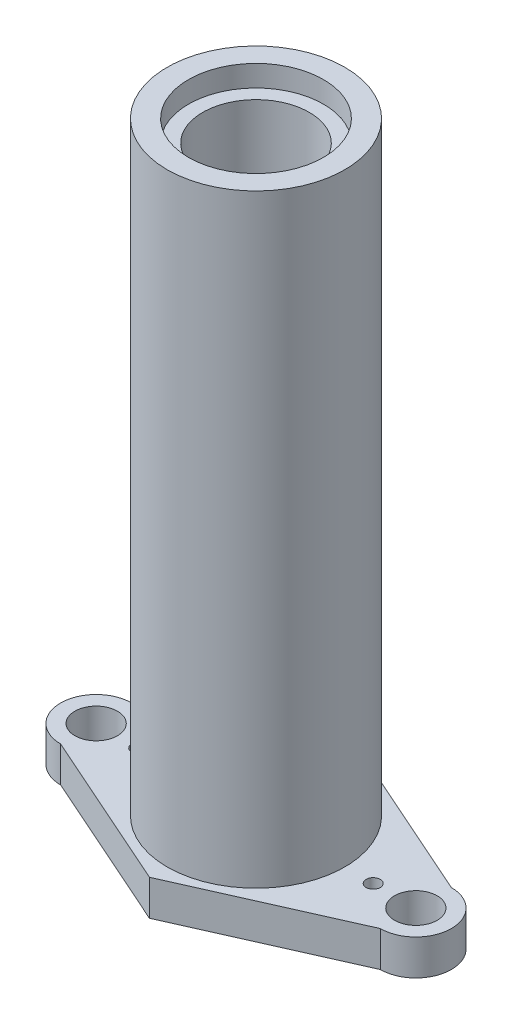
ISO-10303-21;
HEADER;
FILE_DESCRIPTION(('STEP AP214'),'2;1');
FILE_NAME('part.step','',(''),(''),'','','');
FILE_SCHEMA(('AUTOMOTIVE_DESIGN { 1 0 10303 214 1 1 1 1 }'));
ENDSEC;
DATA;
#1=APPLICATION_CONTEXT('core data for automotive mechanical design processes');
#2=APPLICATION_PROTOCOL_DEFINITION('international standard','automotive_design',2000,#1);
#3=PRODUCT_CONTEXT('',#1,'mechanical');
#4=PRODUCT('Part','Part','',(#3));
#5=PRODUCT_RELATED_PRODUCT_CATEGORY('part','',(#4));
#6=PRODUCT_DEFINITION_FORMATION('','',#4);
#7=PRODUCT_DEFINITION_CONTEXT('part definition',#1,'design');
#8=PRODUCT_DEFINITION('design','',#6,#7);
#9=PRODUCT_DEFINITION_SHAPE('','',#8);
#10=(LENGTH_UNIT() NAMED_UNIT(*) SI_UNIT(.MILLI.,.METRE.));
#11=(NAMED_UNIT(*) PLANE_ANGLE_UNIT() SI_UNIT($,.RADIAN.));
#12=(NAMED_UNIT(*) SI_UNIT($,.STERADIAN.) SOLID_ANGLE_UNIT());
#13=UNCERTAINTY_MEASURE_WITH_UNIT(LENGTH_MEASURE(1.E-05),#10,'distance_accuracy_value','');
#14=(GEOMETRIC_REPRESENTATION_CONTEXT(3) GLOBAL_UNCERTAINTY_ASSIGNED_CONTEXT((#13)) GLOBAL_UNIT_ASSIGNED_CONTEXT((#10,
#11,#12)) REPRESENTATION_CONTEXT('',''));
#15=CARTESIAN_POINT('',(0.,0.,0.));
#16=DIRECTION('',(0.,0.,1.));
#17=DIRECTION('',(1.,0.,0.));
#18=AXIS2_PLACEMENT_3D('',#15,#16,#17);
#19=CARTESIAN_POINT('',(0.,78.,0.869271295597634));
#20=DIRECTION('',(0.,1.,0.));
#21=DIRECTION('',(0.,0.,1.));
#22=AXIS2_PLACEMENT_3D('',#19,#20,#21);
#23=CYLINDRICAL_SURFACE('',#22,7.5);
#24=CARTESIAN_POINT('',(0.,78.,0.869271295597634));
#25=DIRECTION('',(0.,1.,0.));
#26=DIRECTION('',(0.,0.,1.));
#27=AXIS2_PLACEMENT_3D('',#24,#25,#26);
#28=CIRCLE('',#27,7.5);
#29=CARTESIAN_POINT('',(0.,78.,8.36927129559763));
#30=VERTEX_POINT('',#29);
#31=EDGE_CURVE('E167',#30,#30,#28,.T.);
#32=ORIENTED_EDGE('',*,*,#31,.F.);
#33=EDGE_LOOP('',(#32));
#34=FACE_BOUND('',#33,.T.);
#35=CARTESIAN_POINT('',(0.,87.,0.869271295597634));
#36=DIRECTION('',(0.,1.,0.));
#37=DIRECTION('',(0.,0.,1.));
#38=AXIS2_PLACEMENT_3D('',#35,#36,#37);
#39=CIRCLE('',#38,7.5);
#40=CARTESIAN_POINT('',(0.,87.,8.36927129559763));
#41=VERTEX_POINT('',#40);
#42=EDGE_CURVE('E40',#41,#41,#39,.F.);
#43=ORIENTED_EDGE('',*,*,#42,.F.);
#44=EDGE_LOOP('',(#43));
#45=FACE_BOUND('',#44,.T.);
#46=ADVANCED_FACE('F36',(#34,#45),#23,.F.);
#47=CARTESIAN_POINT('',(0.,0.,0.869271295597634));
#48=DIRECTION('',(0.,1.,0.));
#49=DIRECTION('',(0.,0.,1.));
#50=AXIS2_PLACEMENT_3D('',#47,#48,#49);
#51=CYLINDRICAL_SURFACE('',#50,4.);
#52=CARTESIAN_POINT('',(0.,75.,0.869271295597634));
#53=DIRECTION('',(0.,1.,0.));
#54=DIRECTION('',(0.,0.,1.));
#55=AXIS2_PLACEMENT_3D('',#52,#53,#54);
#56=CIRCLE('',#55,4.);
#57=CARTESIAN_POINT('',(0.,75.,4.86927129559763));
#58=VERTEX_POINT('',#57);
#59=EDGE_CURVE('E162',#58,#58,#56,.T.);
#60=CARTESIAN_POINT('',(0.,78.,0.869271295597634));
#61=DIRECTION('',(0.,1.,0.));
#62=DIRECTION('',(0.,0.,1.));
#63=AXIS2_PLACEMENT_3D('',#60,#61,#62);
#64=CIRCLE('',#63,4.);
#65=CARTESIAN_POINT('',(0.,78.,4.86927129559763));
#66=VERTEX_POINT('',#65);
#67=EDGE_CURVE('E165',#66,#66,#64,.F.);
#68=CARTESIAN_POINT('',(0.,75.,4.86927129559763));
#69=CARTESIAN_POINT('',(0.,75.03125,4.86927129559763));
#70=CARTESIAN_POINT('',(0.,75.0625,4.86927129559763));
#71=CARTESIAN_POINT('',(0.,75.125,4.86927129559763));
#72=CARTESIAN_POINT('',(0.,75.15625,4.86927129559763));
#73=CARTESIAN_POINT('',(0.,75.21875,4.86927129559763));
#74=CARTESIAN_POINT('',(0.,75.25,4.86927129559763));
#75=CARTESIAN_POINT('',(0.,75.3125,4.86927129559763));
#76=CARTESIAN_POINT('',(0.,75.34375,4.86927129559763));
#77=CARTESIAN_POINT('',(0.,75.40625,4.86927129559763));
#78=CARTESIAN_POINT('',(0.,75.4375,4.86927129559763));
#79=CARTESIAN_POINT('',(0.,75.5,4.86927129559763));
#80=CARTESIAN_POINT('',(0.,75.53125,4.86927129559763));
#81=CARTESIAN_POINT('',(0.,75.59375,4.86927129559763));
#82=CARTESIAN_POINT('',(0.,75.625,4.86927129559763));
#83=CARTESIAN_POINT('',(0.,75.6875,4.86927129559763));
#84=CARTESIAN_POINT('',(0.,75.71875,4.86927129559763));
#85=CARTESIAN_POINT('',(0.,75.78125,4.86927129559763));
#86=CARTESIAN_POINT('',(0.,75.8125,4.86927129559763));
#87=CARTESIAN_POINT('',(0.,75.875,4.86927129559763));
#88=CARTESIAN_POINT('',(0.,75.90625,4.86927129559763));
#89=CARTESIAN_POINT('',(0.,75.96875,4.86927129559763));
#90=CARTESIAN_POINT('',(0.,76.,4.86927129559763));
#91=CARTESIAN_POINT('',(0.,76.0625,4.86927129559763));
#92=CARTESIAN_POINT('',(0.,76.09375,4.86927129559763));
#93=CARTESIAN_POINT('',(0.,76.15625,4.86927129559763));
#94=CARTESIAN_POINT('',(0.,76.1875,4.86927129559763));
#95=CARTESIAN_POINT('',(0.,76.25,4.86927129559763));
#96=CARTESIAN_POINT('',(0.,76.28125,4.86927129559763));
#97=CARTESIAN_POINT('',(0.,76.34375,4.86927129559763));
#98=CARTESIAN_POINT('',(0.,76.375,4.86927129559763));
#99=CARTESIAN_POINT('',(0.,76.4375,4.86927129559763));
#100=CARTESIAN_POINT('',(0.,76.46875,4.86927129559763));
#101=CARTESIAN_POINT('',(0.,76.53125,4.86927129559763));
#102=CARTESIAN_POINT('',(0.,76.5625,4.86927129559763));
#103=CARTESIAN_POINT('',(0.,76.625,4.86927129559763));
#104=CARTESIAN_POINT('',(0.,76.65625,4.86927129559763));
#105=CARTESIAN_POINT('',(0.,76.71875,4.86927129559763));
#106=CARTESIAN_POINT('',(0.,76.75,4.86927129559763));
#107=CARTESIAN_POINT('',(0.,76.8125,4.86927129559763));
#108=CARTESIAN_POINT('',(0.,76.84375,4.86927129559763));
#109=CARTESIAN_POINT('',(0.,76.90625,4.86927129559763));
#110=CARTESIAN_POINT('',(0.,76.9375,4.86927129559763));
#111=CARTESIAN_POINT('',(0.,77.,4.86927129559763));
#112=CARTESIAN_POINT('',(0.,77.03125,4.86927129559763));
#113=CARTESIAN_POINT('',(0.,77.09375,4.86927129559763));
#114=CARTESIAN_POINT('',(0.,77.125,4.86927129559763));
#115=CARTESIAN_POINT('',(0.,77.1875,4.86927129559763));
#116=CARTESIAN_POINT('',(0.,77.21875,4.86927129559763));
#117=CARTESIAN_POINT('',(0.,77.28125,4.86927129559763));
#118=CARTESIAN_POINT('',(0.,77.3125,4.86927129559763));
#119=CARTESIAN_POINT('',(0.,77.375,4.86927129559763));
#120=CARTESIAN_POINT('',(0.,77.40625,4.86927129559763));
#121=CARTESIAN_POINT('',(0.,77.46875,4.86927129559763));
#122=CARTESIAN_POINT('',(0.,77.5,4.86927129559763));
#123=CARTESIAN_POINT('',(0.,77.5625,4.86927129559763));
#124=CARTESIAN_POINT('',(0.,77.59375,4.86927129559763));
#125=CARTESIAN_POINT('',(0.,77.65625,4.86927129559763));
#126=CARTESIAN_POINT('',(0.,77.6875,4.86927129559763));
#127=CARTESIAN_POINT('',(0.,77.75,4.86927129559763));
#128=CARTESIAN_POINT('',(0.,77.78125,4.86927129559763));
#129=CARTESIAN_POINT('',(0.,77.84375,4.86927129559763));
#130=CARTESIAN_POINT('',(0.,77.875,4.86927129559763));
#131=CARTESIAN_POINT('',(0.,77.9375,4.86927129559763));
#132=CARTESIAN_POINT('',(0.,77.96875,4.86927129559763));
#133=CARTESIAN_POINT('',(0.,78.,4.86927129559763));
#134=B_SPLINE_CURVE_WITH_KNOTS('',3,(#68,#69,#70,#71,#72,#73,#74,#75,#76,#77,#78,#79,#80,#81,
#82,#83,#84,#85,#86,#87,#88,#89,#90,#91,#92,#93,#94,#95,#96,#97,#98,#99,#100,#101,#102,#103,
#104,#105,#106,#107,#108,#109,#110,#111,#112,#113,#114,#115,#116,#117,#118,#119,#120,#121,#122,
#123,#124,#125,#126,#127,#128,#129,#130,#131,#132,#133),.UNSPECIFIED.,.F.,.F.,(4,2,2,2,2,2,2,2,
2,2,2,2,2,2,2,2,2,2,2,2,2,2,2,2,2,2,2,2,2,2,2,2,4),(0.,0.0937500000000036,0.187500000000007,
0.281249999999997,0.375,0.468750000000004,0.562499999999994,0.656249999999997,0.750000000000001,
0.843750000000004,0.937500000000008,1.03125,1.125,1.21875,1.31249999999999,1.40625,1.5,1.59375,
1.68750000000001,1.78125,1.875,1.96875000000001,2.06249999999999,2.15625,2.25,2.34375000000001,
2.43750000000001,2.53125,2.625,2.71875000000001,2.8125,2.90625,3.),.UNSPECIFIED.);
#135=EDGE_CURVE('BSEAM218',#58,#66,#134,.T.);
#136=ORIENTED_EDGE('',*,*,#59,.F.);
#137=ORIENTED_EDGE('',*,*,#67,.F.);
#138=ORIENTED_EDGE('',*,*,#135,.T.);
#139=ORIENTED_EDGE('',*,*,#135,.F.);
#140=EDGE_LOOP('',(#136,#138,#137,#139));
#141=FACE_BOUND('',#140,.T.);
#142=ADVANCED_FACE('F218',(#141),#51,.F.);
#143=CARTESIAN_POINT('',(0.,5.,0.));
#144=DIRECTION('',(0.,1.,0.));
#145=DIRECTION('',(0.,0.,1.));
#146=AXIS2_PLACEMENT_3D('',#143,#144,#145);
#147=PLANE('',#146);
#148=CARTESIAN_POINT('',(-22.5,5.,0.869271295597634));
#149=DIRECTION('',(0.,1.,0.));
#150=DIRECTION('',(0.,0.,1.));
#151=AXIS2_PLACEMENT_3D('',#148,#149,#150);
#152=CIRCLE('',#151,3.);
#153=CARTESIAN_POINT('',(-22.5,5.,3.86927129559764));
#154=VERTEX_POINT('',#153);
#155=EDGE_CURVE('E124',#154,#154,#152,.T.);
#156=ORIENTED_EDGE('',*,*,#155,.F.);
#157=EDGE_LOOP('',(#156));
#158=FACE_BOUND('',#157,.T.);
#159=CARTESIAN_POINT('',(22.5,5.,0.869271295597634));
#160=DIRECTION('',(0.,1.,0.));
#161=DIRECTION('',(0.,0.,1.));
#162=AXIS2_PLACEMENT_3D('',#159,#160,#161);
#163=CIRCLE('',#162,2.99999999999999);
#164=CARTESIAN_POINT('',(22.5,5.,3.86927129559763));
#165=VERTEX_POINT('',#164);
#166=EDGE_CURVE('E118',#165,#165,#163,.T.);
#167=ORIENTED_EDGE('',*,*,#166,.F.);
#168=EDGE_LOOP('',(#167));
#169=FACE_BOUND('',#168,.T.);
#170=CARTESIAN_POINT('',(22.5,5.,0.869271295597634));
#171=DIRECTION('',(0.,1.,0.));
#172=DIRECTION('',(0.,0.,1.));
#173=AXIS2_PLACEMENT_3D('',#170,#171,#172);
#174=CIRCLE('',#173,5.);
#175=CARTESIAN_POINT('',(22.5,5.,-4.13072870440236));
#176=VERTEX_POINT('',#175);
#177=CARTESIAN_POINT('',(22.5,5.,5.86927129559764));
#178=VERTEX_POINT('',#177);
#179=EDGE_CURVE('E192',#176,#178,#174,.F.);
#180=ORIENTED_EDGE('',*,*,#179,.F.);
#181=DIRECTION('',(0.913811548620257,0.,0.406138466053448));
#182=VECTOR('',#181,1.);
#183=CARTESIAN_POINT('',(5.2443941583349,5.,-11.7998868562535));
#184=LINE('',#183,#182);
#185=CARTESIAN_POINT('',(0.,5.,-14.1307287044024));
#186=VERTEX_POINT('',#185);
#187=EDGE_CURVE('E194',#186,#176,#184,.T.);
#188=ORIENTED_EDGE('',*,*,#187,.F.);
#189=DIRECTION('',(0.913811548620257,0.,-0.406138466053447));
#190=VECTOR('',#189,1.);
#191=CARTESIAN_POINT('',(-5.2443941583349,5.,-11.7998868562535));
#192=LINE('',#191,#190);
#193=CARTESIAN_POINT('',(-22.5,5.,-4.13072870440236));
#194=VERTEX_POINT('',#193);
#195=EDGE_CURVE('E103',#194,#186,#192,.T.);
#196=ORIENTED_EDGE('',*,*,#195,.F.);
#197=CARTESIAN_POINT('',(-22.5,5.,0.869271295597634));
#198=DIRECTION('',(0.,1.,0.));
#199=DIRECTION('',(0.,0.,1.));
#200=AXIS2_PLACEMENT_3D('',#197,#198,#199);
#201=CIRCLE('',#200,5.);
#202=CARTESIAN_POINT('',(-22.5,5.,5.86927129559763));
#203=VERTEX_POINT('',#202);
#204=EDGE_CURVE('E94',#194,#203,#201,.T.);
#205=ORIENTED_EDGE('',*,*,#204,.T.);
#206=DIRECTION('',(-0.913811548620257,0.,-0.406138466053447));
#207=VECTOR('',#206,1.);
#208=CARTESIAN_POINT('',(-5.8896264602218,5.,13.251659535499));
#209=LINE('',#208,#207);
#210=CARTESIAN_POINT('',(0.,5.,15.8692712955976));
#211=VERTEX_POINT('',#210);
#212=EDGE_CURVE('E100',#211,#203,#209,.T.);
#213=ORIENTED_EDGE('',*,*,#212,.F.);
#214=DIRECTION('',(-0.913811548620257,0.,0.406138466053448));
#215=VECTOR('',#214,1.);
#216=CARTESIAN_POINT('',(5.88962646022181,5.,13.2516595354991));
#217=LINE('',#216,#215);
#218=EDGE_CURVE('E116',#178,#211,#217,.T.);
#219=ORIENTED_EDGE('',*,*,#218,.F.);
#220=EDGE_LOOP('',(#180,#188,#196,#205,#213,#219));
#221=FACE_BOUND('',#220,.T.);
#222=CARTESIAN_POINT('',(-16.5,5.,0.869271295597634));
#223=DIRECTION('',(0.,1.,0.));
#224=DIRECTION('',(0.,0.,1.));
#225=AXIS2_PLACEMENT_3D('',#222,#223,#224);
#226=CIRCLE('',#225,1.);
#227=CARTESIAN_POINT('',(-16.5,5.,1.86927129559764));
#228=VERTEX_POINT('',#227);
#229=EDGE_CURVE('E189',#228,#228,#226,.T.);
#230=ORIENTED_EDGE('',*,*,#229,.F.);
#231=EDGE_LOOP('',(#230));
#232=FACE_BOUND('',#231,.T.);
#233=CARTESIAN_POINT('',(16.5,5.,0.869271295597634));
#234=DIRECTION('',(0.,1.,0.));
#235=DIRECTION('',(0.,0.,1.));
#236=AXIS2_PLACEMENT_3D('',#233,#234,#235);
#237=CIRCLE('',#236,1.);
#238=CARTESIAN_POINT('',(16.5,5.,1.86927129559764));
#239=VERTEX_POINT('',#238);
#240=EDGE_CURVE('E157',#239,#239,#237,.T.);
#241=ORIENTED_EDGE('',*,*,#240,.F.);
#242=EDGE_LOOP('',(#241));
#243=FACE_BOUND('',#242,.T.);
#244=CARTESIAN_POINT('',(0.,5.,0.869271295597634));
#245=DIRECTION('',(0.,1.,0.));
#246=DIRECTION('',(0.,0.,1.));
#247=AXIS2_PLACEMENT_3D('',#244,#245,#246);
#248=CIRCLE('',#247,12.5);
#249=CARTESIAN_POINT('',(0.,5.,13.3692712955976));
#250=VERTEX_POINT('',#249);
#251=EDGE_CURVE('E131',#250,#250,#248,.T.);
#252=ORIENTED_EDGE('',*,*,#251,.F.);
#253=EDGE_LOOP('',(#252));
#254=FACE_BOUND('',#253,.T.);
#255=ADVANCED_FACE('F96',(#158,#169,#221,#232,#243,#254),#147,.T.);
#256=CARTESIAN_POINT('',(22.5,5.,0.869271295597634));
#257=DIRECTION('',(0.,-1.,0.));
#258=DIRECTION('',(0.,0.,-1.));
#259=AXIS2_PLACEMENT_3D('',#256,#257,#258);
#260=CYLINDRICAL_SURFACE('',#259,5.);
#261=CARTESIAN_POINT('',(22.5,0.,0.869271295597634));
#262=DIRECTION('',(0.,1.,0.));
#263=DIRECTION('',(0.,0.,1.));
#264=AXIS2_PLACEMENT_3D('',#261,#262,#263);
#265=CIRCLE('',#264,5.);
#266=CARTESIAN_POINT('',(22.5,0.,-4.13072870440236));
#267=VERTEX_POINT('',#266);
#268=CARTESIAN_POINT('',(22.5,0.,5.86927129559764));
#269=VERTEX_POINT('',#268);
#270=EDGE_CURVE('E134',#267,#269,#265,.F.);
#271=ORIENTED_EDGE('',*,*,#270,.F.);
#272=DIRECTION('',(0.,-1.,0.));
#273=VECTOR('',#272,1.);
#274=CARTESIAN_POINT('',(22.5,5.,-4.13072870440236));
#275=LINE('',#274,#273);
#276=EDGE_CURVE('E11',#176,#267,#275,.T.);
#277=ORIENTED_EDGE('',*,*,#276,.F.);
#278=ORIENTED_EDGE('',*,*,#179,.T.);
#279=DIRECTION('',(0.,-1.,0.));
#280=VECTOR('',#279,1.);
#281=CARTESIAN_POINT('',(22.5,5.,5.86927129559764));
#282=LINE('',#281,#280);
#283=EDGE_CURVE('E55',#178,#269,#282,.T.);
#284=ORIENTED_EDGE('',*,*,#283,.T.);
#285=EDGE_LOOP('',(#271,#277,#278,#284));
#286=FACE_BOUND('',#285,.T.);
#287=ADVANCED_FACE('F245',(#286),#260,.T.);
#288=CARTESIAN_POINT('',(5.2443941583349,5.,-11.7998868562535));
#289=DIRECTION('',(0.406138466053448,0.,-0.913811548620257));
#290=DIRECTION('',(-0.913811548620257,0.,-0.406138466053448));
#291=AXIS2_PLACEMENT_3D('',#288,#289,#290);
#292=PLANE('',#291);
#293=DIRECTION('',(0.913811548620257,0.,0.406138466053448));
#294=VECTOR('',#293,1.);
#295=CARTESIAN_POINT('',(5.2443941583349,0.,-11.7998868562535));
#296=LINE('',#295,#294);
#297=CARTESIAN_POINT('',(0.,0.,-14.1307287044024));
#298=VERTEX_POINT('',#297);
#299=EDGE_CURVE('E136',#298,#267,#296,.T.);
#300=ORIENTED_EDGE('',*,*,#299,.F.);
#301=DIRECTION('',(0.,-1.,0.));
#302=VECTOR('',#301,1.);
#303=CARTESIAN_POINT('',(0.,5.,-14.1307287044024));
#304=LINE('',#303,#302);
#305=EDGE_CURVE('E46',#186,#298,#304,.T.);
#306=ORIENTED_EDGE('',*,*,#305,.F.);
#307=ORIENTED_EDGE('',*,*,#187,.T.);
#308=ORIENTED_EDGE('',*,*,#276,.T.);
#309=EDGE_LOOP('',(#300,#306,#307,#308));
#310=FACE_BOUND('',#309,.T.);
#311=ADVANCED_FACE('F274',(#310),#292,.T.);
#312=CARTESIAN_POINT('',(-5.2443941583349,5.,-11.7998868562535));
#313=DIRECTION('',(-0.406138466053447,0.,-0.913811548620257));
#314=DIRECTION('',(-0.913811548620257,0.,0.406138466053448));
#315=AXIS2_PLACEMENT_3D('',#312,#313,#314);
#316=PLANE('',#315);
#317=DIRECTION('',(0.913811548620257,0.,-0.406138466053447));
#318=VECTOR('',#317,1.);
#319=CARTESIAN_POINT('',(-5.2443941583349,0.,-11.7998868562535));
#320=LINE('',#319,#318);
#321=CARTESIAN_POINT('',(-22.5,0.,-4.13072870440236));
#322=VERTEX_POINT('',#321);
#323=EDGE_CURVE('E139',#322,#298,#320,.T.);
#324=ORIENTED_EDGE('',*,*,#323,.F.);
#325=DIRECTION('',(0.,-1.,0.));
#326=VECTOR('',#325,1.);
#327=CARTESIAN_POINT('',(-22.5,5.,-4.13072870440236));
#328=LINE('',#327,#326);
#329=EDGE_CURVE('E113',#194,#322,#328,.T.);
#330=ORIENTED_EDGE('',*,*,#329,.F.);
#331=ORIENTED_EDGE('',*,*,#195,.T.);
#332=ORIENTED_EDGE('',*,*,#305,.T.);
#333=EDGE_LOOP('',(#324,#330,#331,#332));
#334=FACE_BOUND('',#333,.T.);
#335=ADVANCED_FACE('F198',(#334),#316,.T.);
#336=CARTESIAN_POINT('',(-22.5,5.,0.869271295597634));
#337=DIRECTION('',(0.,-1.,0.));
#338=DIRECTION('',(0.,0.,-1.));
#339=AXIS2_PLACEMENT_3D('',#336,#337,#338);
#340=CYLINDRICAL_SURFACE('',#339,5.);
#341=CARTESIAN_POINT('',(-22.5,0.,0.869271295597634));
#342=DIRECTION('',(0.,1.,0.));
#343=DIRECTION('',(0.,0.,1.));
#344=AXIS2_PLACEMENT_3D('',#341,#342,#343);
#345=CIRCLE('',#344,5.);
#346=CARTESIAN_POINT('',(-22.5,0.,5.86927129559763));
#347=VERTEX_POINT('',#346);
#348=EDGE_CURVE('E110',#322,#347,#345,.T.);
#349=ORIENTED_EDGE('',*,*,#348,.T.);
#350=DIRECTION('',(0.,-1.,0.));
#351=VECTOR('',#350,1.);
#352=CARTESIAN_POINT('',(-22.5,5.,5.86927129559763));
#353=LINE('',#352,#351);
#354=EDGE_CURVE('E107',#203,#347,#353,.T.);
#355=ORIENTED_EDGE('',*,*,#354,.F.);
#356=ORIENTED_EDGE('',*,*,#204,.F.);
#357=ORIENTED_EDGE('',*,*,#329,.T.);
#358=EDGE_LOOP('',(#349,#355,#356,#357));
#359=FACE_BOUND('',#358,.T.);
#360=ADVANCED_FACE('F108',(#359),#340,.T.);
#361=CARTESIAN_POINT('',(-5.8896264602218,5.,13.251659535499));
#362=DIRECTION('',(-0.406138466053447,0.,0.913811548620257));
#363=DIRECTION('',(0.913811548620257,0.,0.406138466053448));
#364=AXIS2_PLACEMENT_3D('',#361,#362,#363);
#365=PLANE('',#364);
#366=DIRECTION('',(-0.913811548620257,0.,-0.406138466053447));
#367=VECTOR('',#366,1.);
#368=CARTESIAN_POINT('',(-5.8896264602218,0.,13.251659535499));
#369=LINE('',#368,#367);
#370=CARTESIAN_POINT('',(0.,0.,15.8692712955976));
#371=VERTEX_POINT('',#370);
#372=EDGE_CURVE('E143',#371,#347,#369,.T.);
#373=ORIENTED_EDGE('',*,*,#372,.F.);
#374=DIRECTION('',(0.,-1.,0.));
#375=VECTOR('',#374,1.);
#376=CARTESIAN_POINT('',(0.,5.,15.8692712955976));
#377=LINE('',#376,#375);
#378=EDGE_CURVE('E74',#211,#371,#377,.T.);
#379=ORIENTED_EDGE('',*,*,#378,.F.);
#380=ORIENTED_EDGE('',*,*,#212,.T.);
#381=ORIENTED_EDGE('',*,*,#354,.T.);
#382=EDGE_LOOP('',(#373,#379,#380,#381));
#383=FACE_BOUND('',#382,.T.);
#384=ADVANCED_FACE('F115',(#383),#365,.T.);
#385=CARTESIAN_POINT('',(0.,5.,0.869271295597634));
#386=DIRECTION('',(0.,-1.,0.));
#387=DIRECTION('',(0.,0.,-1.));
#388=AXIS2_PLACEMENT_3D('',#385,#386,#387);
#389=CYLINDRICAL_SURFACE('',#388,10.);
#390=CARTESIAN_POINT('',(0.,0.,0.869271295597634));
#391=DIRECTION('',(0.,1.,0.));
#392=DIRECTION('',(0.,0.,1.));
#393=AXIS2_PLACEMENT_3D('',#390,#391,#392);
#394=CIRCLE('',#393,10.);
#395=CARTESIAN_POINT('',(0.,0.,10.8692712955976));
#396=VERTEX_POINT('',#395);
#397=EDGE_CURVE('E151',#396,#396,#394,.T.);
#398=ORIENTED_EDGE('',*,*,#397,.F.);
#399=EDGE_LOOP('',(#398));
#400=FACE_BOUND('',#399,.T.);
#401=CARTESIAN_POINT('',(0.,75.,0.869271295597634));
#402=DIRECTION('',(0.,1.,0.));
#403=DIRECTION('',(0.,0.,1.));
#404=AXIS2_PLACEMENT_3D('',#401,#402,#403);
#405=CIRCLE('',#404,10.);
#406=CARTESIAN_POINT('',(0.,75.,10.8692712955976));
#407=VERTEX_POINT('',#406);
#408=EDGE_CURVE('E182',#407,#407,#405,.T.);
#409=ORIENTED_EDGE('',*,*,#408,.T.);
#410=EDGE_LOOP('',(#409));
#411=FACE_BOUND('',#410,.T.);
#412=ADVANCED_FACE('F213',(#400,#411),#389,.F.);
#413=CARTESIAN_POINT('',(22.5,5.,0.869271295597634));
#414=DIRECTION('',(0.,-1.,0.));
#415=DIRECTION('',(0.,0.,-1.));
#416=AXIS2_PLACEMENT_3D('',#413,#414,#415);
#417=CYLINDRICAL_SURFACE('',#416,2.99999999999999);
#418=ORIENTED_EDGE('',*,*,#166,.T.);
#419=EDGE_LOOP('',(#418));
#420=FACE_BOUND('',#419,.T.);
#421=CARTESIAN_POINT('',(22.5,0.,0.869271295597634));
#422=DIRECTION('',(0.,1.,0.));
#423=DIRECTION('',(0.,0.,1.));
#424=AXIS2_PLACEMENT_3D('',#421,#422,#423);
#425=CIRCLE('',#424,2.99999999999999);
#426=CARTESIAN_POINT('',(22.5,0.,3.86927129559763));
#427=VERTEX_POINT('',#426);
#428=EDGE_CURVE('E148',#427,#427,#425,.T.);
#429=ORIENTED_EDGE('',*,*,#428,.F.);
#430=EDGE_LOOP('',(#429));
#431=FACE_BOUND('',#430,.T.);
#432=ADVANCED_FACE('F206',(#420,#431),#417,.F.);
#433=CARTESIAN_POINT('',(5.88962646022181,5.,13.2516595354991));
#434=DIRECTION('',(0.406138466053448,0.,0.913811548620257));
#435=DIRECTION('',(0.913811548620257,0.,-0.406138466053448));
#436=AXIS2_PLACEMENT_3D('',#433,#434,#435);
#437=PLANE('',#436);
#438=DIRECTION('',(-0.913811548620257,0.,0.406138466053448));
#439=VECTOR('',#438,1.);
#440=CARTESIAN_POINT('',(5.88962646022181,0.,13.2516595354991));
#441=LINE('',#440,#439);
#442=EDGE_CURVE('E145',#269,#371,#441,.T.);
#443=ORIENTED_EDGE('',*,*,#442,.F.);
#444=ORIENTED_EDGE('',*,*,#283,.F.);
#445=ORIENTED_EDGE('',*,*,#218,.T.);
#446=ORIENTED_EDGE('',*,*,#378,.T.);
#447=EDGE_LOOP('',(#443,#444,#445,#446));
#448=FACE_BOUND('',#447,.T.);
#449=ADVANCED_FACE('F203',(#448),#437,.T.);
#450=CARTESIAN_POINT('',(-16.5,5.,0.869271295597634));
#451=DIRECTION('',(0.,-1.,0.));
#452=DIRECTION('',(0.,0.,-1.));
#453=AXIS2_PLACEMENT_3D('',#450,#451,#452);
#454=CYLINDRICAL_SURFACE('',#453,1.);
#455=ORIENTED_EDGE('',*,*,#229,.T.);
#456=EDGE_LOOP('',(#455));
#457=FACE_BOUND('',#456,.T.);
#458=CARTESIAN_POINT('',(-16.5,0.,0.869271295597634));
#459=DIRECTION('',(0.,1.,0.));
#460=DIRECTION('',(0.,0.,1.));
#461=AXIS2_PLACEMENT_3D('',#458,#459,#460);
#462=CIRCLE('',#461,1.);
#463=CARTESIAN_POINT('',(-16.5,0.,1.86927129559764));
#464=VERTEX_POINT('',#463);
#465=EDGE_CURVE('E130',#464,#464,#462,.T.);
#466=ORIENTED_EDGE('',*,*,#465,.F.);
#467=EDGE_LOOP('',(#466));
#468=FACE_BOUND('',#467,.T.);
#469=ADVANCED_FACE('F205',(#457,#468),#454,.F.);
#470=CARTESIAN_POINT('',(16.5,5.,0.869271295597634));
#471=DIRECTION('',(0.,-1.,0.));
#472=DIRECTION('',(0.,0.,-1.));
#473=AXIS2_PLACEMENT_3D('',#470,#471,#472);
#474=CYLINDRICAL_SURFACE('',#473,1.);
#475=ORIENTED_EDGE('',*,*,#240,.T.);
#476=EDGE_LOOP('',(#475));
#477=FACE_BOUND('',#476,.T.);
#478=CARTESIAN_POINT('',(16.5,0.,0.869271295597634));
#479=DIRECTION('',(0.,1.,0.));
#480=DIRECTION('',(0.,0.,1.));
#481=AXIS2_PLACEMENT_3D('',#478,#479,#480);
#482=CIRCLE('',#481,1.);
#483=CARTESIAN_POINT('',(16.5,0.,1.86927129559764));
#484=VERTEX_POINT('',#483);
#485=EDGE_CURVE('E127',#484,#484,#482,.T.);
#486=ORIENTED_EDGE('',*,*,#485,.F.);
#487=EDGE_LOOP('',(#486));
#488=FACE_BOUND('',#487,.T.);
#489=ADVANCED_FACE('F38',(#477,#488),#474,.F.);
#490=CARTESIAN_POINT('',(-22.5,5.,0.869271295597634));
#491=DIRECTION('',(0.,-1.,0.));
#492=DIRECTION('',(0.,0.,-1.));
#493=AXIS2_PLACEMENT_3D('',#490,#491,#492);
#494=CYLINDRICAL_SURFACE('',#493,3.);
#495=ORIENTED_EDGE('',*,*,#155,.T.);
#496=EDGE_LOOP('',(#495));
#497=FACE_BOUND('',#496,.T.);
#498=CARTESIAN_POINT('',(-22.5,0.,0.869271295597634));
#499=DIRECTION('',(0.,1.,0.));
#500=DIRECTION('',(0.,0.,1.));
#501=AXIS2_PLACEMENT_3D('',#498,#499,#500);
#502=CIRCLE('',#501,3.);
#503=CARTESIAN_POINT('',(-22.5,0.,3.86927129559764));
#504=VERTEX_POINT('',#503);
#505=EDGE_CURVE('E154',#504,#504,#502,.T.);
#506=ORIENTED_EDGE('',*,*,#505,.F.);
#507=EDGE_LOOP('',(#506));
#508=FACE_BOUND('',#507,.T.);
#509=ADVANCED_FACE('F249',(#497,#508),#494,.F.);
#510=CARTESIAN_POINT('',(0.,0.,0.));
#511=DIRECTION('',(0.,1.,0.));
#512=DIRECTION('',(0.,0.,1.));
#513=AXIS2_PLACEMENT_3D('',#510,#511,#512);
#514=PLANE('',#513);
#515=ORIENTED_EDGE('',*,*,#485,.T.);
#516=EDGE_LOOP('',(#515));
#517=FACE_BOUND('',#516,.T.);
#518=ORIENTED_EDGE('',*,*,#465,.T.);
#519=EDGE_LOOP('',(#518));
#520=FACE_BOUND('',#519,.T.);
#521=ORIENTED_EDGE('',*,*,#270,.T.);
#522=ORIENTED_EDGE('',*,*,#442,.T.);
#523=ORIENTED_EDGE('',*,*,#372,.T.);
#524=ORIENTED_EDGE('',*,*,#348,.F.);
#525=ORIENTED_EDGE('',*,*,#323,.T.);
#526=ORIENTED_EDGE('',*,*,#299,.T.);
#527=EDGE_LOOP('',(#521,#522,#523,#524,#525,#526));
#528=FACE_BOUND('',#527,.T.);
#529=ORIENTED_EDGE('',*,*,#428,.T.);
#530=EDGE_LOOP('',(#529));
#531=FACE_BOUND('',#530,.T.);
#532=ORIENTED_EDGE('',*,*,#397,.T.);
#533=EDGE_LOOP('',(#532));
#534=FACE_BOUND('',#533,.T.);
#535=ORIENTED_EDGE('',*,*,#505,.T.);
#536=EDGE_LOOP('',(#535));
#537=FACE_BOUND('',#536,.T.);
#538=ADVANCED_FACE('F201',(#517,#520,#528,#531,#534,#537),#514,.F.);
#539=CARTESIAN_POINT('',(0.,75.,0.869271295597634));
#540=DIRECTION('',(0.,-1.,0.));
#541=DIRECTION('',(0.,0.,-1.));
#542=AXIS2_PLACEMENT_3D('',#539,#540,#541);
#543=CYLINDRICAL_SURFACE('',#542,12.5);
#544=ORIENTED_EDGE('',*,*,#251,.T.);
#545=EDGE_LOOP('',(#544));
#546=FACE_BOUND('',#545,.T.);
#547=CARTESIAN_POINT('',(0.,90.,0.869271295597634));
#548=DIRECTION('',(0.,1.,0.));
#549=DIRECTION('',(0.,0.,1.));
#550=AXIS2_PLACEMENT_3D('',#547,#548,#549);
#551=CIRCLE('',#550,12.5);
#552=CARTESIAN_POINT('',(0.,90.,13.3692712955976));
#553=VERTEX_POINT('',#552);
#554=EDGE_CURVE('E164',#553,#553,#551,.T.);
#555=ORIENTED_EDGE('',*,*,#554,.F.);
#556=EDGE_LOOP('',(#555));
#557=FACE_BOUND('',#556,.T.);
#558=ADVANCED_FACE('F235',(#546,#557),#543,.T.);
#559=CARTESIAN_POINT('',(0.,90.,0.869271295597634));
#560=DIRECTION('',(0.,1.,0.));
#561=DIRECTION('',(0.,0.,1.));
#562=AXIS2_PLACEMENT_3D('',#559,#560,#561);
#563=PLANE('',#562);
#564=CARTESIAN_POINT('',(0.,90.,0.869271295597634));
#565=DIRECTION('',(0.,1.,0.));
#566=DIRECTION('',(0.,0.,1.));
#567=AXIS2_PLACEMENT_3D('',#564,#565,#566);
#568=CIRCLE('',#567,9.5);
#569=CARTESIAN_POINT('',(0.,90.,10.3692712955976));
#570=VERTEX_POINT('',#569);
#571=EDGE_CURVE('E178',#570,#570,#568,.T.);
#572=ORIENTED_EDGE('',*,*,#571,.F.);
#573=EDGE_LOOP('',(#572));
#574=FACE_BOUND('',#573,.T.);
#575=ORIENTED_EDGE('',*,*,#554,.T.);
#576=EDGE_LOOP('',(#575));
#577=FACE_BOUND('',#576,.T.);
#578=ADVANCED_FACE('F231',(#574,#577),#563,.T.);
#579=CARTESIAN_POINT('',(0.,75.,0.869271295597634));
#580=DIRECTION('',(0.,1.,0.));
#581=DIRECTION('',(0.,0.,1.));
#582=AXIS2_PLACEMENT_3D('',#579,#580,#581);
#583=PLANE('',#582);
#584=ORIENTED_EDGE('',*,*,#59,.T.);
#585=EDGE_LOOP('',(#584));
#586=FACE_BOUND('',#585,.T.);
#587=ORIENTED_EDGE('',*,*,#408,.F.);
#588=EDGE_LOOP('',(#587));
#589=FACE_BOUND('',#588,.T.);
#590=ADVANCED_FACE('F234',(#586,#589),#583,.F.);
#591=CARTESIAN_POINT('',(0.,78.,0.869271295597634));
#592=DIRECTION('',(0.,1.,0.));
#593=DIRECTION('',(0.,0.,1.));
#594=AXIS2_PLACEMENT_3D('',#591,#592,#593);
#595=PLANE('',#594);
#596=ORIENTED_EDGE('',*,*,#31,.T.);
#597=EDGE_LOOP('',(#596));
#598=FACE_BOUND('',#597,.T.);
#599=ORIENTED_EDGE('',*,*,#67,.T.);
#600=EDGE_LOOP('',(#599));
#601=FACE_BOUND('',#600,.T.);
#602=ADVANCED_FACE('F228',(#598,#601),#595,.T.);
#603=CARTESIAN_POINT('',(0.,87.,0.869271295597634));
#604=DIRECTION('',(0.,1.,0.));
#605=DIRECTION('',(0.,0.,1.));
#606=AXIS2_PLACEMENT_3D('',#603,#604,#605);
#607=PLANE('',#606);
#608=CARTESIAN_POINT('',(0.,87.,0.869271295597634));
#609=DIRECTION('',(0.,1.,0.));
#610=DIRECTION('',(0.,0.,1.));
#611=AXIS2_PLACEMENT_3D('',#608,#609,#610);
#612=CIRCLE('',#611,9.5);
#613=CARTESIAN_POINT('',(0.,87.,10.3692712955976));
#614=VERTEX_POINT('',#613);
#615=EDGE_CURVE('E175',#614,#614,#612,.T.);
#616=ORIENTED_EDGE('',*,*,#615,.T.);
#617=EDGE_LOOP('',(#616));
#618=FACE_BOUND('',#617,.T.);
#619=ORIENTED_EDGE('',*,*,#42,.T.);
#620=EDGE_LOOP('',(#619));
#621=FACE_BOUND('',#620,.T.);
#622=ADVANCED_FACE('F372',(#618,#621),#607,.T.);
#623=CARTESIAN_POINT('',(0.,87.,0.869271295597634));
#624=DIRECTION('',(0.,1.,0.));
#625=DIRECTION('',(0.,0.,1.));
#626=AXIS2_PLACEMENT_3D('',#623,#624,#625);
#627=CYLINDRICAL_SURFACE('',#626,9.5);
#628=ORIENTED_EDGE('',*,*,#615,.F.);
#629=EDGE_LOOP('',(#628));
#630=FACE_BOUND('',#629,.T.);
#631=ORIENTED_EDGE('',*,*,#571,.T.);
#632=EDGE_LOOP('',(#631));
#633=FACE_BOUND('',#632,.T.);
#634=ADVANCED_FACE('F390',(#630,#633),#627,.F.);
#635=CLOSED_SHELL('',(#46,#142,#255,#287,#311,#335,#360,#384,#412,#432,#449,#469,#489,#509,#538,
#558,#578,#590,#602,#622,#634));
#636=MANIFOLD_SOLID_BREP('B2',#635);
#637=ADVANCED_BREP_SHAPE_REPRESENTATION('',(#18,#636),#14);
#638=SHAPE_DEFINITION_REPRESENTATION(#9,#637);
ENDSEC;
END-ISO-10303-21;
